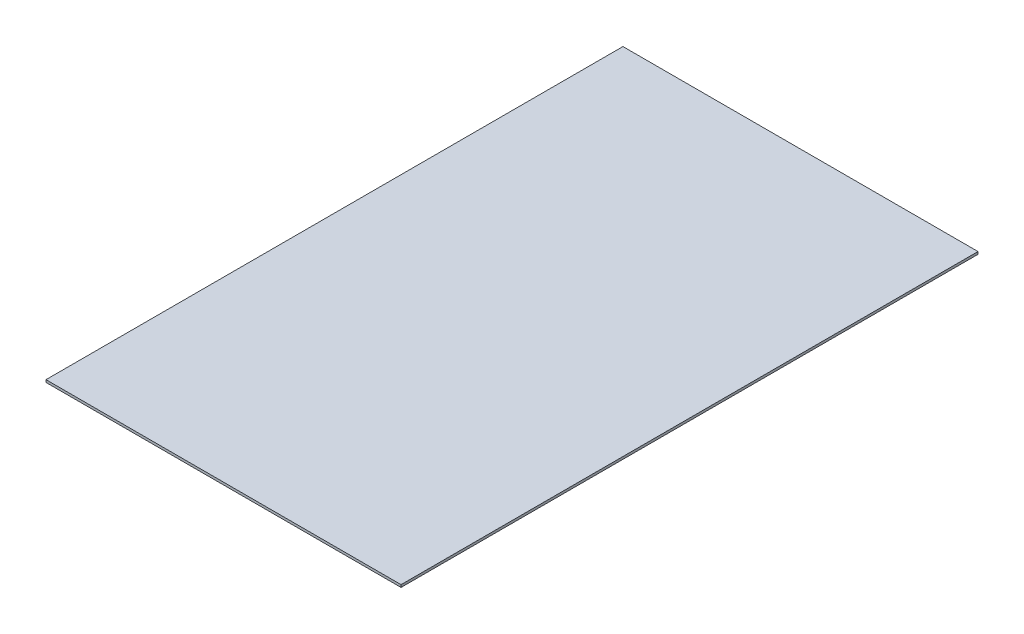
ISO-10303-21;
HEADER;
FILE_DESCRIPTION(('STEP AP214'),'2;1');
FILE_NAME('part.step','',(''),(''),'','','');
FILE_SCHEMA(('AUTOMOTIVE_DESIGN { 1 0 10303 214 1 1 1 1 }'));
ENDSEC;
DATA;
#1=APPLICATION_CONTEXT('core data for automotive mechanical design processes');
#2=APPLICATION_PROTOCOL_DEFINITION('international standard','automotive_design',2000,#1);
#3=PRODUCT_CONTEXT('',#1,'mechanical');
#4=PRODUCT('Part','Part','',(#3));
#5=PRODUCT_RELATED_PRODUCT_CATEGORY('part','',(#4));
#6=PRODUCT_DEFINITION_FORMATION('','',#4);
#7=PRODUCT_DEFINITION_CONTEXT('part definition',#1,'design');
#8=PRODUCT_DEFINITION('design','',#6,#7);
#9=PRODUCT_DEFINITION_SHAPE('','',#8);
#10=(LENGTH_UNIT() NAMED_UNIT(*) SI_UNIT(.MILLI.,.METRE.));
#11=(NAMED_UNIT(*) PLANE_ANGLE_UNIT() SI_UNIT($,.RADIAN.));
#12=(NAMED_UNIT(*) SI_UNIT($,.STERADIAN.) SOLID_ANGLE_UNIT());
#13=UNCERTAINTY_MEASURE_WITH_UNIT(LENGTH_MEASURE(1.E-05),#10,'distance_accuracy_value','');
#14=(GEOMETRIC_REPRESENTATION_CONTEXT(3) GLOBAL_UNCERTAINTY_ASSIGNED_CONTEXT((#13)) GLOBAL_UNIT_ASSIGNED_CONTEXT((#10,
#11,#12)) REPRESENTATION_CONTEXT('',''));
#15=CARTESIAN_POINT('',(0.,0.,0.));
#16=DIRECTION('',(0.,0.,1.));
#17=DIRECTION('',(1.,0.,0.));
#18=AXIS2_PLACEMENT_3D('',#15,#16,#17);
#19=CARTESIAN_POINT('',(0.,0.7,0.));
#20=DIRECTION('',(1.,0.,0.));
#21=DIRECTION('',(0.,0.,-1.));
#22=AXIS2_PLACEMENT_3D('',#19,#20,#21);
#23=PLANE('',#22);
#24=DIRECTION('',(0.,0.,1.));
#25=VECTOR('',#24,1.);
#26=CARTESIAN_POINT('',(0.,0.,0.));
#27=LINE('',#26,#25);
#28=CARTESIAN_POINT('',(0.,0.,0.));
#29=VERTEX_POINT('',#28);
#30=CARTESIAN_POINT('',(0.,0.,165.1));
#31=VERTEX_POINT('',#30);
#32=EDGE_CURVE('E113',#29,#31,#27,.T.);
#33=ORIENTED_EDGE('',*,*,#32,.T.);
#34=DIRECTION('',(0.,-1.,0.));
#35=VECTOR('',#34,1.);
#36=CARTESIAN_POINT('',(0.,0.7,165.1));
#37=LINE('',#36,#35);
#38=CARTESIAN_POINT('',(0.,0.7,165.1));
#39=VERTEX_POINT('',#38);
#40=EDGE_CURVE('E11',#39,#31,#37,.T.);
#41=ORIENTED_EDGE('',*,*,#40,.F.);
#42=DIRECTION('',(0.,0.,1.));
#43=VECTOR('',#42,1.);
#44=CARTESIAN_POINT('',(0.,0.7,0.));
#45=LINE('',#44,#43);
#46=CARTESIAN_POINT('',(0.,0.7,0.));
#47=VERTEX_POINT('',#46);
#48=EDGE_CURVE('E97',#47,#39,#45,.T.);
#49=ORIENTED_EDGE('',*,*,#48,.F.);
#50=DIRECTION('',(0.,-1.,0.));
#51=VECTOR('',#50,1.);
#52=CARTESIAN_POINT('',(0.,0.7,0.));
#53=LINE('',#52,#51);
#54=EDGE_CURVE('E109',#47,#29,#53,.T.);
#55=ORIENTED_EDGE('',*,*,#54,.T.);
#56=EDGE_LOOP('',(#33,#41,#49,#55));
#57=FACE_BOUND('',#56,.T.);
#58=ADVANCED_FACE('F45',(#57),#23,.F.);
#59=CARTESIAN_POINT('',(0.,0.7,165.1));
#60=DIRECTION('',(0.,0.,-1.));
#61=DIRECTION('',(-1.,0.,0.));
#62=AXIS2_PLACEMENT_3D('',#59,#60,#61);
#63=PLANE('',#62);
#64=DIRECTION('',(1.,0.,0.));
#65=VECTOR('',#64,1.);
#66=CARTESIAN_POINT('',(0.,0.,165.1));
#67=LINE('',#66,#65);
#68=CARTESIAN_POINT('',(101.6,0.,165.1));
#69=VERTEX_POINT('',#68);
#70=EDGE_CURVE('E102',#31,#69,#67,.T.);
#71=ORIENTED_EDGE('',*,*,#70,.T.);
#72=DIRECTION('',(0.,-1.,0.));
#73=VECTOR('',#72,1.);
#74=CARTESIAN_POINT('',(101.6,0.7,165.1));
#75=LINE('',#74,#73);
#76=CARTESIAN_POINT('',(101.6,0.7,165.1));
#77=VERTEX_POINT('',#76);
#78=EDGE_CURVE('E54',#77,#69,#75,.T.);
#79=ORIENTED_EDGE('',*,*,#78,.F.);
#80=DIRECTION('',(1.,0.,0.));
#81=VECTOR('',#80,1.);
#82=CARTESIAN_POINT('',(0.,0.7,165.1));
#83=LINE('',#82,#81);
#84=EDGE_CURVE('E92',#39,#77,#83,.T.);
#85=ORIENTED_EDGE('',*,*,#84,.F.);
#86=ORIENTED_EDGE('',*,*,#40,.T.);
#87=EDGE_LOOP('',(#71,#79,#85,#86));
#88=FACE_BOUND('',#87,.T.);
#89=ADVANCED_FACE('F101',(#88),#63,.F.);
#90=CARTESIAN_POINT('',(101.6,0.7,0.));
#91=DIRECTION('',(-1.,0.,0.));
#92=DIRECTION('',(0.,0.,1.));
#93=AXIS2_PLACEMENT_3D('',#90,#91,#92);
#94=PLANE('',#93);
#95=DIRECTION('',(0.,0.,-1.));
#96=VECTOR('',#95,1.);
#97=CARTESIAN_POINT('',(101.6,0.,0.));
#98=LINE('',#97,#96);
#99=CARTESIAN_POINT('',(101.6,0.,0.));
#100=VERTEX_POINT('',#99);
#101=EDGE_CURVE('E79',#69,#100,#98,.T.);
#102=ORIENTED_EDGE('',*,*,#101,.T.);
#103=DIRECTION('',(0.,-1.,0.));
#104=VECTOR('',#103,1.);
#105=CARTESIAN_POINT('',(101.6,0.7,0.));
#106=LINE('',#105,#104);
#107=CARTESIAN_POINT('',(101.6,0.7,0.));
#108=VERTEX_POINT('',#107);
#109=EDGE_CURVE('E104',#108,#100,#106,.T.);
#110=ORIENTED_EDGE('',*,*,#109,.F.);
#111=DIRECTION('',(0.,0.,-1.));
#112=VECTOR('',#111,1.);
#113=CARTESIAN_POINT('',(101.6,0.7,0.));
#114=LINE('',#113,#112);
#115=EDGE_CURVE('E95',#77,#108,#114,.T.);
#116=ORIENTED_EDGE('',*,*,#115,.F.);
#117=ORIENTED_EDGE('',*,*,#78,.T.);
#118=EDGE_LOOP('',(#102,#110,#116,#117));
#119=FACE_BOUND('',#118,.T.);
#120=ADVANCED_FACE('F105',(#119),#94,.F.);
#121=CARTESIAN_POINT('',(0.,0.7,0.));
#122=DIRECTION('',(0.,0.,1.));
#123=DIRECTION('',(1.,0.,0.));
#124=AXIS2_PLACEMENT_3D('',#121,#122,#123);
#125=PLANE('',#124);
#126=DIRECTION('',(-1.,0.,0.));
#127=VECTOR('',#126,1.);
#128=CARTESIAN_POINT('',(0.,0.,0.));
#129=LINE('',#128,#127);
#130=EDGE_CURVE('E85',#100,#29,#129,.T.);
#131=ORIENTED_EDGE('',*,*,#130,.T.);
#132=ORIENTED_EDGE('',*,*,#54,.F.);
#133=DIRECTION('',(-1.,0.,0.));
#134=VECTOR('',#133,1.);
#135=CARTESIAN_POINT('',(0.,0.7,0.));
#136=LINE('',#135,#134);
#137=EDGE_CURVE('E62',#108,#47,#136,.T.);
#138=ORIENTED_EDGE('',*,*,#137,.F.);
#139=ORIENTED_EDGE('',*,*,#109,.T.);
#140=EDGE_LOOP('',(#131,#132,#138,#139));
#141=FACE_BOUND('',#140,.T.);
#142=ADVANCED_FACE('F126',(#141),#125,.F.);
#143=CARTESIAN_POINT('',(0.,0.7,0.));
#144=DIRECTION('',(0.,1.,0.));
#145=DIRECTION('',(0.,0.,1.));
#146=AXIS2_PLACEMENT_3D('',#143,#144,#145);
#147=PLANE('',#146);
#148=ORIENTED_EDGE('',*,*,#48,.T.);
#149=ORIENTED_EDGE('',*,*,#84,.T.);
#150=ORIENTED_EDGE('',*,*,#115,.T.);
#151=ORIENTED_EDGE('',*,*,#137,.T.);
#152=EDGE_LOOP('',(#148,#149,#150,#151));
#153=FACE_BOUND('',#152,.T.);
#154=ADVANCED_FACE('F93',(#153),#147,.T.);
#155=CARTESIAN_POINT('',(0.,0.,0.));
#156=DIRECTION('',(0.,1.,0.));
#157=DIRECTION('',(0.,0.,1.));
#158=AXIS2_PLACEMENT_3D('',#155,#156,#157);
#159=PLANE('',#158);
#160=ORIENTED_EDGE('',*,*,#32,.F.);
#161=ORIENTED_EDGE('',*,*,#130,.F.);
#162=ORIENTED_EDGE('',*,*,#101,.F.);
#163=ORIENTED_EDGE('',*,*,#70,.F.);
#164=EDGE_LOOP('',(#160,#161,#162,#163));
#165=FACE_BOUND('',#164,.T.);
#166=ADVANCED_FACE('F129',(#165),#159,.F.);
#167=CLOSED_SHELL('',(#58,#89,#120,#142,#154,#166));
#168=MANIFOLD_SOLID_BREP('B2',#167);
#169=ADVANCED_BREP_SHAPE_REPRESENTATION('',(#18,#168),#14);
#170=SHAPE_DEFINITION_REPRESENTATION(#9,#169);
ENDSEC;
END-ISO-10303-21;
